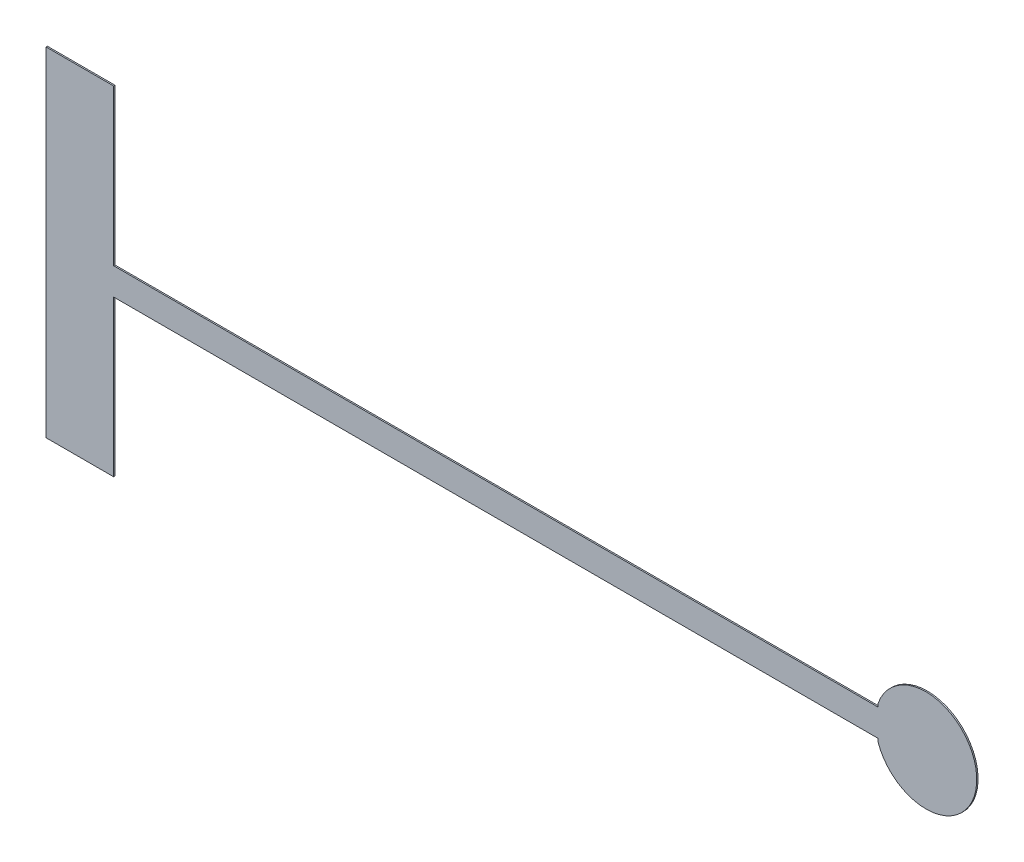
ISO-10303-21;
HEADER;
FILE_DESCRIPTION(('STEP AP214'),'2;1');
FILE_NAME('part.step','',(''),(''),'','','');
FILE_SCHEMA(('AUTOMOTIVE_DESIGN { 1 0 10303 214 1 1 1 1 }'));
ENDSEC;
DATA;
#1=APPLICATION_CONTEXT('core data for automotive mechanical design processes');
#2=APPLICATION_PROTOCOL_DEFINITION('international standard','automotive_design',2000,#1);
#3=PRODUCT_CONTEXT('',#1,'mechanical');
#4=PRODUCT('Part','Part','',(#3));
#5=PRODUCT_RELATED_PRODUCT_CATEGORY('part','',(#4));
#6=PRODUCT_DEFINITION_FORMATION('','',#4);
#7=PRODUCT_DEFINITION_CONTEXT('part definition',#1,'design');
#8=PRODUCT_DEFINITION('design','',#6,#7);
#9=PRODUCT_DEFINITION_SHAPE('','',#8);
#10=(LENGTH_UNIT() NAMED_UNIT(*) SI_UNIT(.MILLI.,.METRE.));
#11=(NAMED_UNIT(*) PLANE_ANGLE_UNIT() SI_UNIT($,.RADIAN.));
#12=(NAMED_UNIT(*) SI_UNIT($,.STERADIAN.) SOLID_ANGLE_UNIT());
#13=UNCERTAINTY_MEASURE_WITH_UNIT(LENGTH_MEASURE(1.E-05),#10,'distance_accuracy_value','');
#14=(GEOMETRIC_REPRESENTATION_CONTEXT(3) GLOBAL_UNCERTAINTY_ASSIGNED_CONTEXT((#13)) GLOBAL_UNIT_ASSIGNED_CONTEXT((#10,
#11,#12)) REPRESENTATION_CONTEXT('',''));
#15=CARTESIAN_POINT('',(0.,0.,0.));
#16=DIRECTION('',(0.,0.,1.));
#17=DIRECTION('',(1.,0.,0.));
#18=AXIS2_PLACEMENT_3D('',#15,#16,#17);
#19=CARTESIAN_POINT('',(1000.,-250.,-20.));
#20=DIRECTION('',(0.,-1.,0.));
#21=DIRECTION('',(1.,0.,0.));
#22=AXIS2_PLACEMENT_3D('',#19,#20,#21);
#23=PLANE('',#22);
#24=DIRECTION('',(1.,0.,0.));
#25=VECTOR('',#24,1.);
#26=CARTESIAN_POINT('',(1000.,-250.,0.));
#27=LINE('',#26,#25);
#28=CARTESIAN_POINT('',(11290.9262444463,-250.,0.));
#29=VERTEX_POINT('',#28);
#30=CARTESIAN_POINT('',(11292.8932188135,-250.,0.));
#31=VERTEX_POINT('',#30);
#32=EDGE_CURVE('E152',#29,#31,#27,.T.);
#33=ORIENTED_EDGE('',*,*,#32,.F.);
#34=DIRECTION('',(0.,0.,1.));
#35=VECTOR('',#34,1.);
#36=CARTESIAN_POINT('',(11290.9262444463,-250.,-20.));
#37=LINE('',#36,#35);
#38=CARTESIAN_POINT('',(11290.9262444463,-250.,-20.));
#39=VERTEX_POINT('',#38);
#40=EDGE_CURVE('E138',#39,#29,#37,.T.);
#41=ORIENTED_EDGE('',*,*,#40,.F.);
#42=DIRECTION('',(1.,0.,0.));
#43=VECTOR('',#42,1.);
#44=CARTESIAN_POINT('',(1000.,-250.,-20.));
#45=LINE('',#44,#43);
#46=CARTESIAN_POINT('',(11292.8932188135,-250.,-20.));
#47=VERTEX_POINT('',#46);
#48=EDGE_CURVE('E150',#39,#47,#45,.T.);
#49=ORIENTED_EDGE('',*,*,#48,.T.);
#50=DIRECTION('',(0.,0.,1.));
#51=VECTOR('',#50,1.);
#52=CARTESIAN_POINT('',(11292.8932188135,-250.,-20.));
#53=LINE('',#52,#51);
#54=EDGE_CURVE('E214',#47,#31,#53,.T.);
#55=ORIENTED_EDGE('',*,*,#54,.T.);
#56=EDGE_LOOP('',(#33,#41,#49,#55));
#57=FACE_BOUND('',#56,.T.);
#58=ADVANCED_FACE('F42',(#57),#23,.T.);
#59=CARTESIAN_POINT('',(12000.,2.44249065417534E-12,-20.));
#60=DIRECTION('',(0.,0.,1.));
#61=DIRECTION('',(1.,0.,0.));
#62=AXIS2_PLACEMENT_3D('',#59,#60,#61);
#63=PLANE('',#62);
#64=DIRECTION('',(1.,0.,0.));
#65=VECTOR('',#64,1.);
#66=CARTESIAN_POINT('',(0.,-200.,-20.));
#67=LINE('',#66,#65);
#68=CARTESIAN_POINT('',(0.,-200.,-20.));
#69=VERTEX_POINT('',#68);
#70=CARTESIAN_POINT('',(11290.9262444463,-200.,-20.));
#71=VERTEX_POINT('',#70);
#72=EDGE_CURVE('E144',#69,#71,#67,.T.);
#73=ORIENTED_EDGE('',*,*,#72,.F.);
#74=DIRECTION('',(0.,-1.,0.));
#75=VECTOR('',#74,1.);
#76=CARTESIAN_POINT('',(0.,-2500.,-20.));
#77=LINE('',#76,#75);
#78=CARTESIAN_POINT('',(0.,-2500.,-20.));
#79=VERTEX_POINT('',#78);
#80=EDGE_CURVE('E167',#69,#79,#77,.T.);
#81=ORIENTED_EDGE('',*,*,#80,.T.);
#82=DIRECTION('',(1.,0.,0.));
#83=VECTOR('',#82,1.);
#84=CARTESIAN_POINT('',(-1000.,-2500.,-20.));
#85=LINE('',#84,#83);
#86=CARTESIAN_POINT('',(-1000.,-2500.,-20.));
#87=VERTEX_POINT('',#86);
#88=EDGE_CURVE('E179',#87,#79,#85,.T.);
#89=ORIENTED_EDGE('',*,*,#88,.F.);
#90=DIRECTION('',(0.,-1.,0.));
#91=VECTOR('',#90,1.);
#92=CARTESIAN_POINT('',(-1000.,2500.,-20.));
#93=LINE('',#92,#91);
#94=CARTESIAN_POINT('',(-1000.,2500.,-20.));
#95=VERTEX_POINT('',#94);
#96=EDGE_CURVE('E175',#95,#87,#93,.T.);
#97=ORIENTED_EDGE('',*,*,#96,.F.);
#98=DIRECTION('',(-1.,0.,0.));
#99=VECTOR('',#98,1.);
#100=CARTESIAN_POINT('',(-1000.,2500.,-20.));
#101=LINE('',#100,#99);
#102=CARTESIAN_POINT('',(-4.44089209850063E-13,2500.,-20.));
#103=VERTEX_POINT('',#102);
#104=EDGE_CURVE('E172',#103,#95,#101,.T.);
#105=ORIENTED_EDGE('',*,*,#104,.F.);
#106=DIRECTION('',(0.,-1.,0.));
#107=VECTOR('',#106,1.);
#108=CARTESIAN_POINT('',(-4.44089209850063E-13,2500.,-20.));
#109=LINE('',#108,#107);
#110=CARTESIAN_POINT('',(0.,200.,-20.));
#111=VERTEX_POINT('',#110);
#112=EDGE_CURVE('E227',#103,#111,#109,.T.);
#113=ORIENTED_EDGE('',*,*,#112,.T.);
#114=DIRECTION('',(1.,0.,0.));
#115=VECTOR('',#114,1.);
#116=CARTESIAN_POINT('',(0.,200.,-20.));
#117=LINE('',#116,#115);
#118=CARTESIAN_POINT('',(11290.9262444463,200.,-20.));
#119=VERTEX_POINT('',#118);
#120=EDGE_CURVE('E249',#111,#119,#117,.T.);
#121=ORIENTED_EDGE('',*,*,#120,.T.);
#122=DIRECTION('',(0.,1.,0.));
#123=VECTOR('',#122,1.);
#124=CARTESIAN_POINT('',(11290.9262444463,250.,-20.));
#125=LINE('',#124,#123);
#126=CARTESIAN_POINT('',(11290.9262444463,250.,-20.));
#127=VERTEX_POINT('',#126);
#128=EDGE_CURVE('E241',#119,#127,#125,.T.);
#129=ORIENTED_EDGE('',*,*,#128,.T.);
#130=DIRECTION('',(-1.,0.,0.));
#131=VECTOR('',#130,1.);
#132=CARTESIAN_POINT('',(1000.,250.,-20.));
#133=LINE('',#132,#131);
#134=CARTESIAN_POINT('',(11292.8932188135,250.000000000001,-20.));
#135=VERTEX_POINT('',#134);
#136=EDGE_CURVE('E57',#135,#127,#133,.T.);
#137=ORIENTED_EDGE('',*,*,#136,.F.);
#138=CARTESIAN_POINT('',(12000.,2.44249065417534E-12,-20.));
#139=DIRECTION('',(0.,0.,1.));
#140=DIRECTION('',(1.,0.,0.));
#141=AXIS2_PLACEMENT_3D('',#138,#139,#140);
#142=CIRCLE('',#141,749.999999999999);
#143=EDGE_CURVE('E156',#47,#135,#142,.T.);
#144=ORIENTED_EDGE('',*,*,#143,.F.);
#145=ORIENTED_EDGE('',*,*,#48,.F.);
#146=DIRECTION('',(0.,-1.,0.));
#147=VECTOR('',#146,1.);
#148=CARTESIAN_POINT('',(11290.9262444463,-250.,-20.));
#149=LINE('',#148,#147);
#150=EDGE_CURVE('E134',#71,#39,#149,.T.);
#151=ORIENTED_EDGE('',*,*,#150,.F.);
#152=EDGE_LOOP('',(#73,#81,#89,#97,#105,#113,#121,#129,#137,#144,#145,#151));
#153=FACE_BOUND('',#152,.T.);
#154=ADVANCED_FACE('F155',(#153),#63,.F.);
#155=CARTESIAN_POINT('',(12000.,2.44249065417534E-12,0.));
#156=DIRECTION('',(0.,0.,1.));
#157=DIRECTION('',(1.,0.,0.));
#158=AXIS2_PLACEMENT_3D('',#155,#156,#157);
#159=PLANE('',#158);
#160=DIRECTION('',(0.,-1.,0.));
#161=VECTOR('',#160,1.);
#162=CARTESIAN_POINT('',(0.,-2500.,0.));
#163=LINE('',#162,#161);
#164=CARTESIAN_POINT('',(0.,-200.,0.));
#165=VERTEX_POINT('',#164);
#166=CARTESIAN_POINT('',(0.,-2500.,0.));
#167=VERTEX_POINT('',#166);
#168=EDGE_CURVE('E218',#165,#167,#163,.T.);
#169=ORIENTED_EDGE('',*,*,#168,.F.);
#170=DIRECTION('',(1.,0.,0.));
#171=VECTOR('',#170,1.);
#172=CARTESIAN_POINT('',(0.,-200.,0.));
#173=LINE('',#172,#171);
#174=CARTESIAN_POINT('',(11290.9262444463,-200.,0.));
#175=VERTEX_POINT('',#174);
#176=EDGE_CURVE('E145',#165,#175,#173,.T.);
#177=ORIENTED_EDGE('',*,*,#176,.T.);
#178=DIRECTION('',(0.,-1.,0.));
#179=VECTOR('',#178,1.);
#180=CARTESIAN_POINT('',(11290.9262444463,-250.,0.));
#181=LINE('',#180,#179);
#182=EDGE_CURVE('E267',#175,#29,#181,.T.);
#183=ORIENTED_EDGE('',*,*,#182,.T.);
#184=ORIENTED_EDGE('',*,*,#32,.T.);
#185=CARTESIAN_POINT('',(12000.,2.44249065417534E-12,0.));
#186=DIRECTION('',(0.,0.,1.));
#187=DIRECTION('',(1.,0.,0.));
#188=AXIS2_PLACEMENT_3D('',#185,#186,#187);
#189=CIRCLE('',#188,749.999999999999);
#190=CARTESIAN_POINT('',(11292.8932188135,250.000000000001,0.));
#191=VERTEX_POINT('',#190);
#192=EDGE_CURVE('E185',#31,#191,#189,.T.);
#193=ORIENTED_EDGE('',*,*,#192,.T.);
#194=DIRECTION('',(-1.,0.,0.));
#195=VECTOR('',#194,1.);
#196=CARTESIAN_POINT('',(1000.,250.,0.));
#197=LINE('',#196,#195);
#198=CARTESIAN_POINT('',(11290.9262444463,250.,0.));
#199=VERTEX_POINT('',#198);
#200=EDGE_CURVE('E65',#191,#199,#197,.T.);
#201=ORIENTED_EDGE('',*,*,#200,.T.);
#202=DIRECTION('',(0.,1.,0.));
#203=VECTOR('',#202,1.);
#204=CARTESIAN_POINT('',(11290.9262444463,250.,0.));
#205=LINE('',#204,#203);
#206=CARTESIAN_POINT('',(11290.9262444463,200.,0.));
#207=VERTEX_POINT('',#206);
#208=EDGE_CURVE('E246',#207,#199,#205,.T.);
#209=ORIENTED_EDGE('',*,*,#208,.F.);
#210=DIRECTION('',(1.,0.,0.));
#211=VECTOR('',#210,1.);
#212=CARTESIAN_POINT('',(0.,200.,0.));
#213=LINE('',#212,#211);
#214=CARTESIAN_POINT('',(0.,200.,0.));
#215=VERTEX_POINT('',#214);
#216=EDGE_CURVE('E250',#215,#207,#213,.T.);
#217=ORIENTED_EDGE('',*,*,#216,.F.);
#218=DIRECTION('',(0.,-1.,0.));
#219=VECTOR('',#218,1.);
#220=CARTESIAN_POINT('',(-4.44089209850063E-13,2500.,0.));
#221=LINE('',#220,#219);
#222=CARTESIAN_POINT('',(0.,2500.,0.));
#223=VERTEX_POINT('',#222);
#224=EDGE_CURVE('E224',#223,#215,#221,.T.);
#225=ORIENTED_EDGE('',*,*,#224,.F.);
#226=DIRECTION('',(-1.,0.,0.));
#227=VECTOR('',#226,1.);
#228=CARTESIAN_POINT('',(-1000.,2500.,0.));
#229=LINE('',#228,#227);
#230=CARTESIAN_POINT('',(-1000.,2500.,0.));
#231=VERTEX_POINT('',#230);
#232=EDGE_CURVE('E192',#223,#231,#229,.T.);
#233=ORIENTED_EDGE('',*,*,#232,.T.);
#234=DIRECTION('',(0.,-1.,0.));
#235=VECTOR('',#234,1.);
#236=CARTESIAN_POINT('',(-1000.,2500.,0.));
#237=LINE('',#236,#235);
#238=CARTESIAN_POINT('',(-1000.,-2500.,0.));
#239=VERTEX_POINT('',#238);
#240=EDGE_CURVE('E164',#231,#239,#237,.T.);
#241=ORIENTED_EDGE('',*,*,#240,.T.);
#242=DIRECTION('',(1.,0.,0.));
#243=VECTOR('',#242,1.);
#244=CARTESIAN_POINT('',(-1000.,-2500.,0.));
#245=LINE('',#244,#243);
#246=EDGE_CURVE('E158',#239,#167,#245,.T.);
#247=ORIENTED_EDGE('',*,*,#246,.T.);
#248=EDGE_LOOP('',(#169,#177,#183,#184,#193,#201,#209,#217,#225,#233,#241,#247));
#249=FACE_BOUND('',#248,.T.);
#250=ADVANCED_FACE('F200',(#249),#159,.T.);
#251=CARTESIAN_POINT('',(-1000.,-2500.,-20.));
#252=DIRECTION('',(0.,-1.,0.));
#253=DIRECTION('',(0.,0.,-1.));
#254=AXIS2_PLACEMENT_3D('',#251,#252,#253);
#255=PLANE('',#254);
#256=DIRECTION('',(0.,0.,1.));
#257=VECTOR('',#256,1.);
#258=CARTESIAN_POINT('',(0.,-2500.,-20.));
#259=LINE('',#258,#257);
#260=EDGE_CURVE('E209',#79,#167,#259,.T.);
#261=ORIENTED_EDGE('',*,*,#260,.T.);
#262=ORIENTED_EDGE('',*,*,#246,.F.);
#263=DIRECTION('',(0.,0.,1.));
#264=VECTOR('',#263,1.);
#265=CARTESIAN_POINT('',(-1000.,-2500.,-20.));
#266=LINE('',#265,#264);
#267=EDGE_CURVE('E11',#87,#239,#266,.T.);
#268=ORIENTED_EDGE('',*,*,#267,.F.);
#269=ORIENTED_EDGE('',*,*,#88,.T.);
#270=EDGE_LOOP('',(#261,#262,#268,#269));
#271=FACE_BOUND('',#270,.T.);
#272=ADVANCED_FACE('F208',(#271),#255,.T.);
#273=CARTESIAN_POINT('',(-1000.,2500.,-20.));
#274=DIRECTION('',(-1.,0.,0.));
#275=DIRECTION('',(0.,-1.,0.));
#276=AXIS2_PLACEMENT_3D('',#273,#274,#275);
#277=PLANE('',#276);
#278=ORIENTED_EDGE('',*,*,#240,.F.);
#279=DIRECTION('',(0.,0.,1.));
#280=VECTOR('',#279,1.);
#281=CARTESIAN_POINT('',(-1000.,2500.,-20.));
#282=LINE('',#281,#280);
#283=EDGE_CURVE('E45',#95,#231,#282,.T.);
#284=ORIENTED_EDGE('',*,*,#283,.F.);
#285=ORIENTED_EDGE('',*,*,#96,.T.);
#286=ORIENTED_EDGE('',*,*,#267,.T.);
#287=EDGE_LOOP('',(#278,#284,#285,#286));
#288=FACE_BOUND('',#287,.T.);
#289=ADVANCED_FACE('F301',(#288),#277,.T.);
#290=CARTESIAN_POINT('',(-1000.,2500.,-20.));
#291=DIRECTION('',(0.,1.,0.));
#292=DIRECTION('',(0.,0.,1.));
#293=AXIS2_PLACEMENT_3D('',#290,#291,#292);
#294=PLANE('',#293);
#295=DIRECTION('',(0.,0.,1.));
#296=VECTOR('',#295,1.);
#297=CARTESIAN_POINT('',(-4.44089209850063E-13,2500.,-20.));
#298=LINE('',#297,#296);
#299=EDGE_CURVE('E186',#103,#223,#298,.T.);
#300=ORIENTED_EDGE('',*,*,#299,.F.);
#301=ORIENTED_EDGE('',*,*,#104,.T.);
#302=ORIENTED_EDGE('',*,*,#283,.T.);
#303=ORIENTED_EDGE('',*,*,#232,.F.);
#304=EDGE_LOOP('',(#300,#301,#302,#303));
#305=FACE_BOUND('',#304,.T.);
#306=ADVANCED_FACE('F304',(#305),#294,.T.);
#307=CARTESIAN_POINT('',(1000.,250.,-20.));
#308=DIRECTION('',(0.,1.,0.));
#309=DIRECTION('',(0.,0.,1.));
#310=AXIS2_PLACEMENT_3D('',#307,#308,#309);
#311=PLANE('',#310);
#312=DIRECTION('',(0.,0.,1.));
#313=VECTOR('',#312,1.);
#314=CARTESIAN_POINT('',(11290.9262444463,250.,-20.));
#315=LINE('',#314,#313);
#316=EDGE_CURVE('E236',#127,#199,#315,.T.);
#317=ORIENTED_EDGE('',*,*,#316,.T.);
#318=ORIENTED_EDGE('',*,*,#200,.F.);
#319=DIRECTION('',(0.,0.,1.));
#320=VECTOR('',#319,1.);
#321=CARTESIAN_POINT('',(11292.8932188135,250.,-20.));
#322=LINE('',#321,#320);
#323=EDGE_CURVE('E219',#191,#135,#322,.F.);
#324=ORIENTED_EDGE('',*,*,#323,.T.);
#325=ORIENTED_EDGE('',*,*,#136,.T.);
#326=EDGE_LOOP('',(#317,#318,#324,#325));
#327=FACE_BOUND('',#326,.T.);
#328=ADVANCED_FACE('F287',(#327),#311,.T.);
#329=CARTESIAN_POINT('',(12000.,2.44249065417534E-12,-20.));
#330=DIRECTION('',(0.,0.,1.));
#331=DIRECTION('',(1.,0.,0.));
#332=AXIS2_PLACEMENT_3D('',#329,#330,#331);
#333=CYLINDRICAL_SURFACE('',#332,749.999999999999);
#334=ORIENTED_EDGE('',*,*,#323,.F.);
#335=ORIENTED_EDGE('',*,*,#192,.F.);
#336=ORIENTED_EDGE('',*,*,#54,.F.);
#337=ORIENTED_EDGE('',*,*,#143,.T.);
#338=EDGE_LOOP('',(#334,#335,#336,#337));
#339=FACE_BOUND('',#338,.T.);
#340=ADVANCED_FACE('F279',(#339),#333,.T.);
#341=CARTESIAN_POINT('',(0.,-2500.,-20.));
#342=DIRECTION('',(-1.,0.,0.));
#343=DIRECTION('',(0.,0.,1.));
#344=AXIS2_PLACEMENT_3D('',#341,#342,#343);
#345=PLANE('',#344);
#346=ORIENTED_EDGE('',*,*,#168,.T.);
#347=ORIENTED_EDGE('',*,*,#260,.F.);
#348=ORIENTED_EDGE('',*,*,#80,.F.);
#349=DIRECTION('',(0.,0.,1.));
#350=VECTOR('',#349,1.);
#351=CARTESIAN_POINT('',(0.,-200.,-20.));
#352=LINE('',#351,#350);
#353=EDGE_CURVE('E254',#69,#165,#352,.T.);
#354=ORIENTED_EDGE('',*,*,#353,.T.);
#355=EDGE_LOOP('',(#346,#347,#348,#354));
#356=FACE_BOUND('',#355,.T.);
#357=ADVANCED_FACE('F276',(#356),#345,.F.);
#358=CARTESIAN_POINT('',(-4.44089209850063E-13,2500.,-20.));
#359=DIRECTION('',(-1.,0.,0.));
#360=DIRECTION('',(0.,-1.,0.));
#361=AXIS2_PLACEMENT_3D('',#358,#359,#360);
#362=PLANE('',#361);
#363=ORIENTED_EDGE('',*,*,#224,.T.);
#364=DIRECTION('',(0.,0.,1.));
#365=VECTOR('',#364,1.);
#366=CARTESIAN_POINT('',(0.,200.,-20.));
#367=LINE('',#366,#365);
#368=EDGE_CURVE('E237',#111,#215,#367,.T.);
#369=ORIENTED_EDGE('',*,*,#368,.F.);
#370=ORIENTED_EDGE('',*,*,#112,.F.);
#371=ORIENTED_EDGE('',*,*,#299,.T.);
#372=EDGE_LOOP('',(#363,#369,#370,#371));
#373=FACE_BOUND('',#372,.T.);
#374=ADVANCED_FACE('F278',(#373),#362,.F.);
#375=CARTESIAN_POINT('',(11290.9262444463,250.,-20.));
#376=DIRECTION('',(1.,0.,0.));
#377=DIRECTION('',(0.,0.,-1.));
#378=AXIS2_PLACEMENT_3D('',#375,#376,#377);
#379=PLANE('',#378);
#380=ORIENTED_EDGE('',*,*,#208,.T.);
#381=ORIENTED_EDGE('',*,*,#316,.F.);
#382=ORIENTED_EDGE('',*,*,#128,.F.);
#383=DIRECTION('',(0.,0.,1.));
#384=VECTOR('',#383,1.);
#385=CARTESIAN_POINT('',(11290.9262444463,200.,-20.));
#386=LINE('',#385,#384);
#387=EDGE_CURVE('E240',#119,#207,#386,.T.);
#388=ORIENTED_EDGE('',*,*,#387,.T.);
#389=EDGE_LOOP('',(#380,#381,#382,#388));
#390=FACE_BOUND('',#389,.T.);
#391=ADVANCED_FACE('F285',(#390),#379,.F.);
#392=CARTESIAN_POINT('',(0.,200.,-20.));
#393=DIRECTION('',(0.,-1.,0.));
#394=DIRECTION('',(0.,0.,-1.));
#395=AXIS2_PLACEMENT_3D('',#392,#393,#394);
#396=PLANE('',#395);
#397=ORIENTED_EDGE('',*,*,#216,.T.);
#398=ORIENTED_EDGE('',*,*,#387,.F.);
#399=ORIENTED_EDGE('',*,*,#120,.F.);
#400=ORIENTED_EDGE('',*,*,#368,.T.);
#401=EDGE_LOOP('',(#397,#398,#399,#400));
#402=FACE_BOUND('',#401,.T.);
#403=ADVANCED_FACE('F318',(#402),#396,.F.);
#404=CARTESIAN_POINT('',(0.,-200.,-20.));
#405=DIRECTION('',(0.,-1.,0.));
#406=DIRECTION('',(0.,0.,-1.));
#407=AXIS2_PLACEMENT_3D('',#404,#405,#406);
#408=PLANE('',#407);
#409=ORIENTED_EDGE('',*,*,#176,.F.);
#410=ORIENTED_EDGE('',*,*,#353,.F.);
#411=ORIENTED_EDGE('',*,*,#72,.T.);
#412=DIRECTION('',(0.,0.,1.));
#413=VECTOR('',#412,1.);
#414=CARTESIAN_POINT('',(11290.9262444463,-200.,-20.));
#415=LINE('',#414,#413);
#416=EDGE_CURVE('E140',#71,#175,#415,.T.);
#417=ORIENTED_EDGE('',*,*,#416,.T.);
#418=EDGE_LOOP('',(#409,#410,#411,#417));
#419=FACE_BOUND('',#418,.T.);
#420=ADVANCED_FACE('F274',(#419),#408,.T.);
#421=CARTESIAN_POINT('',(11290.9262444463,-250.,-20.));
#422=DIRECTION('',(-1.,0.,0.));
#423=DIRECTION('',(0.,0.,1.));
#424=AXIS2_PLACEMENT_3D('',#421,#422,#423);
#425=PLANE('',#424);
#426=ORIENTED_EDGE('',*,*,#182,.F.);
#427=ORIENTED_EDGE('',*,*,#416,.F.);
#428=ORIENTED_EDGE('',*,*,#150,.T.);
#429=ORIENTED_EDGE('',*,*,#40,.T.);
#430=EDGE_LOOP('',(#426,#427,#428,#429));
#431=FACE_BOUND('',#430,.T.);
#432=ADVANCED_FACE('F137',(#431),#425,.T.);
#433=CLOSED_SHELL('',(#58,#154,#250,#272,#289,#306,#328,#340,#357,#374,#391,#403,#420,#432));
#434=MANIFOLD_SOLID_BREP('B2',#433);
#435=ADVANCED_BREP_SHAPE_REPRESENTATION('',(#18,#434),#14);
#436=SHAPE_DEFINITION_REPRESENTATION(#9,#435);
ENDSEC;
END-ISO-10303-21;
